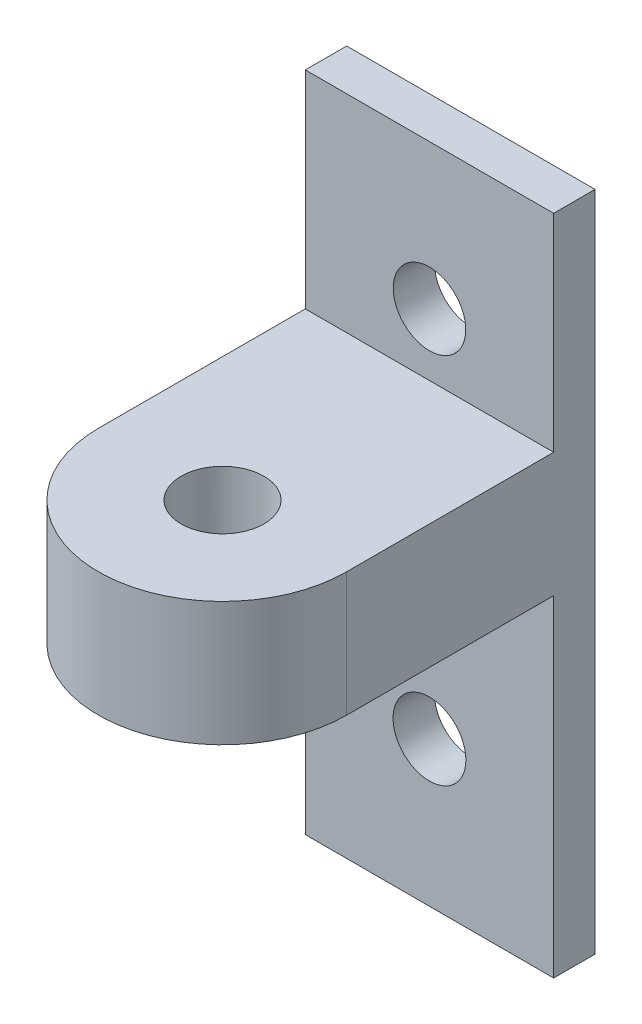
ISO-10303-21;
HEADER;
FILE_DESCRIPTION(('STEP AP214'),'2;1');
FILE_NAME('part.step','',(''),(''),'','','');
FILE_SCHEMA(('AUTOMOTIVE_DESIGN { 1 0 10303 214 1 1 1 1 }'));
ENDSEC;
DATA;
#1=APPLICATION_CONTEXT('core data for automotive mechanical design processes');
#2=APPLICATION_PROTOCOL_DEFINITION('international standard','automotive_design',2000,#1);
#3=PRODUCT_CONTEXT('',#1,'mechanical');
#4=PRODUCT('Part','Part','',(#3));
#5=PRODUCT_RELATED_PRODUCT_CATEGORY('part','',(#4));
#6=PRODUCT_DEFINITION_FORMATION('','',#4);
#7=PRODUCT_DEFINITION_CONTEXT('part definition',#1,'design');
#8=PRODUCT_DEFINITION('design','',#6,#7);
#9=PRODUCT_DEFINITION_SHAPE('','',#8);
#10=(LENGTH_UNIT() NAMED_UNIT(*) SI_UNIT(.MILLI.,.METRE.));
#11=(NAMED_UNIT(*) PLANE_ANGLE_UNIT() SI_UNIT($,.RADIAN.));
#12=(NAMED_UNIT(*) SI_UNIT($,.STERADIAN.) SOLID_ANGLE_UNIT());
#13=UNCERTAINTY_MEASURE_WITH_UNIT(LENGTH_MEASURE(1.E-05),#10,'distance_accuracy_value','');
#14=(GEOMETRIC_REPRESENTATION_CONTEXT(3) GLOBAL_UNCERTAINTY_ASSIGNED_CONTEXT((#13)) GLOBAL_UNIT_ASSIGNED_CONTEXT((#10,
#11,#12)) REPRESENTATION_CONTEXT('',''));
#15=CARTESIAN_POINT('',(0.,0.,0.));
#16=DIRECTION('',(0.,0.,1.));
#17=DIRECTION('',(1.,0.,0.));
#18=AXIS2_PLACEMENT_3D('',#15,#16,#17);
#19=CARTESIAN_POINT('',(0.,0.,6.35));
#20=DIRECTION('',(0.,0.,-1.));
#21=DIRECTION('',(-1.,0.,0.));
#22=AXIS2_PLACEMENT_3D('',#19,#20,#21);
#23=PLANE('',#22);
#24=CARTESIAN_POINT('',(0.,-28.575,6.35));
#25=DIRECTION('',(0.,0.,1.));
#26=DIRECTION('',(1.,0.,0.));
#27=AXIS2_PLACEMENT_3D('',#24,#25,#26);
#28=CIRCLE('',#27,5.588);
#29=CARTESIAN_POINT('',(5.588,-28.575,6.35));
#30=VERTEX_POINT('',#29);
#31=EDGE_CURVE('E142',#30,#30,#28,.T.);
#32=ORIENTED_EDGE('',*,*,#31,.F.);
#33=EDGE_LOOP('',(#32));
#34=FACE_BOUND('',#33,.T.);
#35=DIRECTION('',(1.,0.,0.));
#36=VECTOR('',#35,1.);
#37=CARTESIAN_POINT('',(0.,0.,6.35));
#38=LINE('',#37,#36);
#39=CARTESIAN_POINT('',(-19.05,0.,6.35));
#40=VERTEX_POINT('',#39);
#41=CARTESIAN_POINT('',(19.05,0.,6.35));
#42=VERTEX_POINT('',#41);
#43=EDGE_CURVE('E52',#40,#42,#38,.T.);
#44=ORIENTED_EDGE('',*,*,#43,.F.);
#45=DIRECTION('',(0.,-1.,0.));
#46=VECTOR('',#45,1.);
#47=CARTESIAN_POINT('',(-19.05,-50.8,6.35));
#48=LINE('',#47,#46);
#49=CARTESIAN_POINT('',(-19.05,-50.8,6.35));
#50=VERTEX_POINT('',#49);
#51=EDGE_CURVE('E160',#40,#50,#48,.T.);
#52=ORIENTED_EDGE('',*,*,#51,.T.);
#53=DIRECTION('',(1.,0.,0.));
#54=VECTOR('',#53,1.);
#55=CARTESIAN_POINT('',(-19.05,-50.8,6.35));
#56=LINE('',#55,#54);
#57=CARTESIAN_POINT('',(19.05,-50.8,6.35));
#58=VERTEX_POINT('',#57);
#59=EDGE_CURVE('E162',#50,#58,#56,.T.);
#60=ORIENTED_EDGE('',*,*,#59,.T.);
#61=DIRECTION('',(0.,1.,0.));
#62=VECTOR('',#61,1.);
#63=CARTESIAN_POINT('',(19.05,-50.8,6.35));
#64=LINE('',#63,#62);
#65=EDGE_CURVE('E155',#58,#42,#64,.T.);
#66=ORIENTED_EDGE('',*,*,#65,.T.);
#67=EDGE_LOOP('',(#44,#52,#60,#66));
#68=FACE_BOUND('',#67,.T.);
#69=ADVANCED_FACE('F37',(#34,#68),#23,.F.);
#70=CARTESIAN_POINT('',(19.05,-50.8,6.35));
#71=DIRECTION('',(-1.,0.,0.));
#72=DIRECTION('',(0.,0.,1.));
#73=AXIS2_PLACEMENT_3D('',#70,#71,#72);
#74=PLANE('',#73);
#75=DIRECTION('',(0.,1.,0.));
#76=VECTOR('',#75,1.);
#77=CARTESIAN_POINT('',(19.05,-50.8,0.));
#78=LINE('',#77,#76);
#79=CARTESIAN_POINT('',(19.05,-50.8,0.));
#80=VERTEX_POINT('',#79);
#81=CARTESIAN_POINT('',(19.05,50.8,0.));
#82=VERTEX_POINT('',#81);
#83=EDGE_CURVE('E146',#80,#82,#78,.T.);
#84=ORIENTED_EDGE('',*,*,#83,.T.);
#85=DIRECTION('',(0.,0.,-1.));
#86=VECTOR('',#85,1.);
#87=CARTESIAN_POINT('',(19.05,50.8,6.35));
#88=LINE('',#87,#86);
#89=CARTESIAN_POINT('',(19.05,50.8,6.35));
#90=VERTEX_POINT('',#89);
#91=EDGE_CURVE('E11',#90,#82,#88,.T.);
#92=ORIENTED_EDGE('',*,*,#91,.F.);
#93=CARTESIAN_POINT('',(19.05,19.05,6.35));
#94=VERTEX_POINT('',#93);
#95=EDGE_CURVE('E158',#94,#90,#64,.T.);
#96=ORIENTED_EDGE('',*,*,#95,.F.);
#97=DIRECTION('',(0.,0.,-1.));
#98=VECTOR('',#97,1.);
#99=CARTESIAN_POINT('',(19.05,19.05,38.1));
#100=LINE('',#99,#98);
#101=CARTESIAN_POINT('',(19.05,19.05,38.1));
#102=VERTEX_POINT('',#101);
#103=EDGE_CURVE('E109',#102,#94,#100,.T.);
#104=ORIENTED_EDGE('',*,*,#103,.F.);
#105=DIRECTION('',(0.,1.,0.));
#106=VECTOR('',#105,1.);
#107=CARTESIAN_POINT('',(19.05,0.,38.1));
#108=LINE('',#107,#106);
#109=CARTESIAN_POINT('',(19.05,0.,38.1));
#110=VERTEX_POINT('',#109);
#111=EDGE_CURVE('E102',#110,#102,#108,.T.);
#112=ORIENTED_EDGE('',*,*,#111,.F.);
#113=DIRECTION('',(0.,0.,-1.));
#114=VECTOR('',#113,1.);
#115=CARTESIAN_POINT('',(19.05,0.,38.1));
#116=LINE('',#115,#114);
#117=EDGE_CURVE('E106',#110,#42,#116,.T.);
#118=ORIENTED_EDGE('',*,*,#117,.T.);
#119=ORIENTED_EDGE('',*,*,#65,.F.);
#120=DIRECTION('',(0.,0.,-1.));
#121=VECTOR('',#120,1.);
#122=CARTESIAN_POINT('',(19.05,-50.8,6.35));
#123=LINE('',#122,#121);
#124=EDGE_CURVE('E164',#58,#80,#123,.T.);
#125=ORIENTED_EDGE('',*,*,#124,.T.);
#126=EDGE_LOOP('',(#84,#92,#96,#104,#112,#118,#119,#125));
#127=FACE_BOUND('',#126,.T.);
#128=ADVANCED_FACE('F39',(#127),#74,.F.);
#129=CARTESIAN_POINT('',(-19.05,50.8,6.35));
#130=DIRECTION('',(0.,-1.,0.));
#131=DIRECTION('',(0.,0.,-1.));
#132=AXIS2_PLACEMENT_3D('',#129,#130,#131);
#133=PLANE('',#132);
#134=DIRECTION('',(-1.,0.,0.));
#135=VECTOR('',#134,1.);
#136=CARTESIAN_POINT('',(-19.05,50.8,0.));
#137=LINE('',#136,#135);
#138=CARTESIAN_POINT('',(-19.05,50.8,0.));
#139=VERTEX_POINT('',#138);
#140=EDGE_CURVE('E166',#82,#139,#137,.T.);
#141=ORIENTED_EDGE('',*,*,#140,.T.);
#142=DIRECTION('',(0.,0.,-1.));
#143=VECTOR('',#142,1.);
#144=CARTESIAN_POINT('',(-19.05,50.8,6.35));
#145=LINE('',#144,#143);
#146=CARTESIAN_POINT('',(-19.05,50.8,6.35));
#147=VERTEX_POINT('',#146);
#148=EDGE_CURVE('E45',#147,#139,#145,.T.);
#149=ORIENTED_EDGE('',*,*,#148,.F.);
#150=DIRECTION('',(-1.,0.,0.));
#151=VECTOR('',#150,1.);
#152=CARTESIAN_POINT('',(-19.05,50.8,6.35));
#153=LINE('',#152,#151);
#154=EDGE_CURVE('E157',#90,#147,#153,.T.);
#155=ORIENTED_EDGE('',*,*,#154,.F.);
#156=ORIENTED_EDGE('',*,*,#91,.T.);
#157=EDGE_LOOP('',(#141,#149,#155,#156));
#158=FACE_BOUND('',#157,.T.);
#159=ADVANCED_FACE('F197',(#158),#133,.F.);
#160=CARTESIAN_POINT('',(-19.05,-50.8,6.35));
#161=DIRECTION('',(1.,0.,0.));
#162=DIRECTION('',(0.,0.,-1.));
#163=AXIS2_PLACEMENT_3D('',#160,#161,#162);
#164=PLANE('',#163);
#165=DIRECTION('',(0.,-1.,0.));
#166=VECTOR('',#165,1.);
#167=CARTESIAN_POINT('',(-19.05,-50.8,0.));
#168=LINE('',#167,#166);
#169=CARTESIAN_POINT('',(-19.05,-50.8,0.));
#170=VERTEX_POINT('',#169);
#171=EDGE_CURVE('E168',#139,#170,#168,.T.);
#172=ORIENTED_EDGE('',*,*,#171,.T.);
#173=DIRECTION('',(0.,0.,-1.));
#174=VECTOR('',#173,1.);
#175=CARTESIAN_POINT('',(-19.05,-50.8,6.35));
#176=LINE('',#175,#174);
#177=EDGE_CURVE('E174',#50,#170,#176,.T.);
#178=ORIENTED_EDGE('',*,*,#177,.F.);
#179=ORIENTED_EDGE('',*,*,#51,.F.);
#180=DIRECTION('',(0.,0.,-1.));
#181=VECTOR('',#180,1.);
#182=CARTESIAN_POINT('',(-19.05,0.,38.1));
#183=LINE('',#182,#181);
#184=CARTESIAN_POINT('',(-19.05,0.,38.1));
#185=VERTEX_POINT('',#184);
#186=EDGE_CURVE('E121',#185,#40,#183,.T.);
#187=ORIENTED_EDGE('',*,*,#186,.F.);
#188=DIRECTION('',(0.,-1.,0.));
#189=VECTOR('',#188,1.);
#190=CARTESIAN_POINT('',(-19.05,0.,38.1));
#191=LINE('',#190,#189);
#192=CARTESIAN_POINT('',(-19.05,19.05,38.1));
#193=VERTEX_POINT('',#192);
#194=EDGE_CURVE('E114',#193,#185,#191,.T.);
#195=ORIENTED_EDGE('',*,*,#194,.F.);
#196=DIRECTION('',(0.,0.,-1.));
#197=VECTOR('',#196,1.);
#198=CARTESIAN_POINT('',(-19.05,19.05,38.1));
#199=LINE('',#198,#197);
#200=CARTESIAN_POINT('',(-19.05,19.05,6.35));
#201=VERTEX_POINT('',#200);
#202=EDGE_CURVE('E140',#193,#201,#199,.T.);
#203=ORIENTED_EDGE('',*,*,#202,.T.);
#204=EDGE_CURVE('E60',#147,#201,#48,.T.);
#205=ORIENTED_EDGE('',*,*,#204,.F.);
#206=ORIENTED_EDGE('',*,*,#148,.T.);
#207=EDGE_LOOP('',(#172,#178,#179,#187,#195,#203,#205,#206));
#208=FACE_BOUND('',#207,.T.);
#209=ADVANCED_FACE('F180',(#208),#164,.F.);
#210=CARTESIAN_POINT('',(-19.05,-50.8,6.35));
#211=DIRECTION('',(0.,1.,0.));
#212=DIRECTION('',(0.,0.,1.));
#213=AXIS2_PLACEMENT_3D('',#210,#211,#212);
#214=PLANE('',#213);
#215=DIRECTION('',(1.,0.,0.));
#216=VECTOR('',#215,1.);
#217=CARTESIAN_POINT('',(-19.05,-50.8,0.));
#218=LINE('',#217,#216);
#219=EDGE_CURVE('E170',#170,#80,#218,.T.);
#220=ORIENTED_EDGE('',*,*,#219,.T.);
#221=ORIENTED_EDGE('',*,*,#124,.F.);
#222=ORIENTED_EDGE('',*,*,#59,.F.);
#223=ORIENTED_EDGE('',*,*,#177,.T.);
#224=EDGE_LOOP('',(#220,#221,#222,#223));
#225=FACE_BOUND('',#224,.T.);
#226=ADVANCED_FACE('F190',(#225),#214,.F.);
#227=CARTESIAN_POINT('',(0.,28.575,6.35));
#228=DIRECTION('',(0.,0.,1.));
#229=DIRECTION('',(1.,0.,0.));
#230=AXIS2_PLACEMENT_3D('',#227,#228,#229);
#231=CIRCLE('',#230,5.5626);
#232=CARTESIAN_POINT('',(5.5626,28.575,6.35));
#233=VERTEX_POINT('',#232);
#234=EDGE_CURVE('E147',#233,#233,#231,.T.);
#235=ORIENTED_EDGE('',*,*,#234,.F.);
#236=EDGE_LOOP('',(#235));
#237=FACE_BOUND('',#236,.T.);
#238=ORIENTED_EDGE('',*,*,#204,.T.);
#239=DIRECTION('',(1.,0.,0.));
#240=VECTOR('',#239,1.);
#241=CARTESIAN_POINT('',(0.,19.05,6.35));
#242=LINE('',#241,#240);
#243=EDGE_CURVE('E129',#201,#94,#242,.T.);
#244=ORIENTED_EDGE('',*,*,#243,.T.);
#245=ORIENTED_EDGE('',*,*,#95,.T.);
#246=ORIENTED_EDGE('',*,*,#154,.T.);
#247=EDGE_LOOP('',(#238,#244,#245,#246));
#248=FACE_BOUND('',#247,.T.);
#249=ADVANCED_FACE('F196',(#237,#248),#23,.F.);
#250=CARTESIAN_POINT('',(0.,0.,0.));
#251=DIRECTION('',(0.,0.,-1.));
#252=DIRECTION('',(-1.,0.,0.));
#253=AXIS2_PLACEMENT_3D('',#250,#251,#252);
#254=PLANE('',#253);
#255=CARTESIAN_POINT('',(0.,28.575,0.));
#256=DIRECTION('',(0.,0.,1.));
#257=DIRECTION('',(1.,0.,0.));
#258=AXIS2_PLACEMENT_3D('',#255,#256,#257);
#259=CIRCLE('',#258,5.5626);
#260=CARTESIAN_POINT('',(5.5626,28.575,0.));
#261=VERTEX_POINT('',#260);
#262=EDGE_CURVE('E143',#261,#261,#259,.T.);
#263=ORIENTED_EDGE('',*,*,#262,.T.);
#264=EDGE_LOOP('',(#263));
#265=FACE_BOUND('',#264,.T.);
#266=CARTESIAN_POINT('',(0.,-28.575,0.));
#267=DIRECTION('',(0.,0.,1.));
#268=DIRECTION('',(1.,0.,0.));
#269=AXIS2_PLACEMENT_3D('',#266,#267,#268);
#270=CIRCLE('',#269,5.588);
#271=CARTESIAN_POINT('',(5.588,-28.575,0.));
#272=VERTEX_POINT('',#271);
#273=EDGE_CURVE('E150',#272,#272,#270,.T.);
#274=ORIENTED_EDGE('',*,*,#273,.T.);
#275=EDGE_LOOP('',(#274));
#276=FACE_BOUND('',#275,.T.);
#277=ORIENTED_EDGE('',*,*,#83,.F.);
#278=ORIENTED_EDGE('',*,*,#219,.F.);
#279=ORIENTED_EDGE('',*,*,#171,.F.);
#280=ORIENTED_EDGE('',*,*,#140,.F.);
#281=EDGE_LOOP('',(#277,#278,#279,#280));
#282=FACE_BOUND('',#281,.T.);
#283=ADVANCED_FACE('F187',(#265,#276,#282),#254,.T.);
#284=CARTESIAN_POINT('',(0.,-28.575,0.));
#285=DIRECTION('',(0.,0.,1.));
#286=DIRECTION('',(1.,0.,0.));
#287=AXIS2_PLACEMENT_3D('',#284,#285,#286);
#288=CYLINDRICAL_SURFACE('',#287,5.588);
#289=ORIENTED_EDGE('',*,*,#273,.F.);
#290=EDGE_LOOP('',(#289));
#291=FACE_BOUND('',#290,.T.);
#292=ORIENTED_EDGE('',*,*,#31,.T.);
#293=EDGE_LOOP('',(#292));
#294=FACE_BOUND('',#293,.T.);
#295=ADVANCED_FACE('F218',(#291,#294),#288,.F.);
#296=CARTESIAN_POINT('',(0.,28.575,0.));
#297=DIRECTION('',(0.,0.,1.));
#298=DIRECTION('',(1.,0.,0.));
#299=AXIS2_PLACEMENT_3D('',#296,#297,#298);
#300=CYLINDRICAL_SURFACE('',#299,5.5626);
#301=ORIENTED_EDGE('',*,*,#262,.F.);
#302=EDGE_LOOP('',(#301));
#303=FACE_BOUND('',#302,.T.);
#304=ORIENTED_EDGE('',*,*,#234,.T.);
#305=EDGE_LOOP('',(#304));
#306=FACE_BOUND('',#305,.T.);
#307=ADVANCED_FACE('F223',(#303,#306),#300,.F.);
#308=CARTESIAN_POINT('',(0.,19.05,38.1));
#309=DIRECTION('',(0.,1.,0.));
#310=DIRECTION('',(0.,0.,1.));
#311=AXIS2_PLACEMENT_3D('',#308,#309,#310);
#312=PLANE('',#311);
#313=CARTESIAN_POINT('',(0.,19.05,38.1));
#314=DIRECTION('',(0.,1.,0.));
#315=DIRECTION('',(0.,0.,1.));
#316=AXIS2_PLACEMENT_3D('',#313,#314,#315);
#317=CIRCLE('',#316,6.35);
#318=CARTESIAN_POINT('',(0.,19.05,44.45));
#319=VERTEX_POINT('',#318);
#320=EDGE_CURVE('E127',#319,#319,#317,.T.);
#321=ORIENTED_EDGE('',*,*,#320,.F.);
#322=EDGE_LOOP('',(#321));
#323=FACE_BOUND('',#322,.T.);
#324=ORIENTED_EDGE('',*,*,#243,.F.);
#325=ORIENTED_EDGE('',*,*,#202,.F.);
#326=CARTESIAN_POINT('',(0.,19.05,38.1));
#327=DIRECTION('',(0.,-1.,0.));
#328=DIRECTION('',(0.,0.,-1.));
#329=AXIS2_PLACEMENT_3D('',#326,#327,#328);
#330=CIRCLE('',#329,19.05);
#331=EDGE_CURVE('E126',#102,#193,#330,.T.);
#332=ORIENTED_EDGE('',*,*,#331,.F.);
#333=ORIENTED_EDGE('',*,*,#103,.T.);
#334=EDGE_LOOP('',(#324,#325,#332,#333));
#335=FACE_BOUND('',#334,.T.);
#336=ADVANCED_FACE('F195',(#323,#335),#312,.T.);
#337=CARTESIAN_POINT('',(0.,0.,38.1));
#338=DIRECTION('',(0.,1.,0.));
#339=DIRECTION('',(0.,0.,1.));
#340=AXIS2_PLACEMENT_3D('',#337,#338,#339);
#341=PLANE('',#340);
#342=CARTESIAN_POINT('',(0.,0.,38.1));
#343=DIRECTION('',(0.,-1.,0.));
#344=DIRECTION('',(0.,0.,-1.));
#345=AXIS2_PLACEMENT_3D('',#342,#343,#344);
#346=CIRCLE('',#345,6.35);
#347=CARTESIAN_POINT('',(0.,0.,31.75));
#348=VERTEX_POINT('',#347);
#349=EDGE_CURVE('E132',#348,#348,#346,.T.);
#350=ORIENTED_EDGE('',*,*,#349,.F.);
#351=EDGE_LOOP('',(#350));
#352=FACE_BOUND('',#351,.T.);
#353=ORIENTED_EDGE('',*,*,#43,.T.);
#354=ORIENTED_EDGE('',*,*,#117,.F.);
#355=CARTESIAN_POINT('',(0.,0.,38.1));
#356=DIRECTION('',(0.,-1.,0.));
#357=DIRECTION('',(0.,0.,-1.));
#358=AXIS2_PLACEMENT_3D('',#355,#356,#357);
#359=CIRCLE('',#358,19.05);
#360=EDGE_CURVE('E120',#110,#185,#359,.T.);
#361=ORIENTED_EDGE('',*,*,#360,.T.);
#362=ORIENTED_EDGE('',*,*,#186,.T.);
#363=EDGE_LOOP('',(#353,#354,#361,#362));
#364=FACE_BOUND('',#363,.T.);
#365=ADVANCED_FACE('F118',(#352,#364),#341,.F.);
#366=CARTESIAN_POINT('',(0.,19.05,38.1));
#367=DIRECTION('',(0.,-1.,0.));
#368=DIRECTION('',(0.,0.,-1.));
#369=AXIS2_PLACEMENT_3D('',#366,#367,#368);
#370=CYLINDRICAL_SURFACE('',#369,19.05);
#371=ORIENTED_EDGE('',*,*,#360,.F.);
#372=ORIENTED_EDGE('',*,*,#111,.T.);
#373=ORIENTED_EDGE('',*,*,#331,.T.);
#374=ORIENTED_EDGE('',*,*,#194,.T.);
#375=EDGE_LOOP('',(#371,#372,#373,#374));
#376=FACE_BOUND('',#375,.T.);
#377=ADVANCED_FACE('F124',(#376),#370,.T.);
#378=CARTESIAN_POINT('',(0.,50.8,38.1));
#379=DIRECTION('',(0.,-1.,0.));
#380=DIRECTION('',(0.,0.,-1.));
#381=AXIS2_PLACEMENT_3D('',#378,#379,#380);
#382=CYLINDRICAL_SURFACE('',#381,6.35);
#383=ORIENTED_EDGE('',*,*,#320,.T.);
#384=EDGE_LOOP('',(#383));
#385=FACE_BOUND('',#384,.T.);
#386=ORIENTED_EDGE('',*,*,#349,.T.);
#387=EDGE_LOOP('',(#386));
#388=FACE_BOUND('',#387,.T.);
#389=ADVANCED_FACE('F241',(#385,#388),#382,.F.);
#390=CLOSED_SHELL('',(#69,#128,#159,#209,#226,#249,#283,#295,#307,#336,#365,#377,#389));
#391=MANIFOLD_SOLID_BREP('B2',#390);
#392=ADVANCED_BREP_SHAPE_REPRESENTATION('',(#18,#391),#14);
#393=SHAPE_DEFINITION_REPRESENTATION(#9,#392);
ENDSEC;
END-ISO-10303-21;
